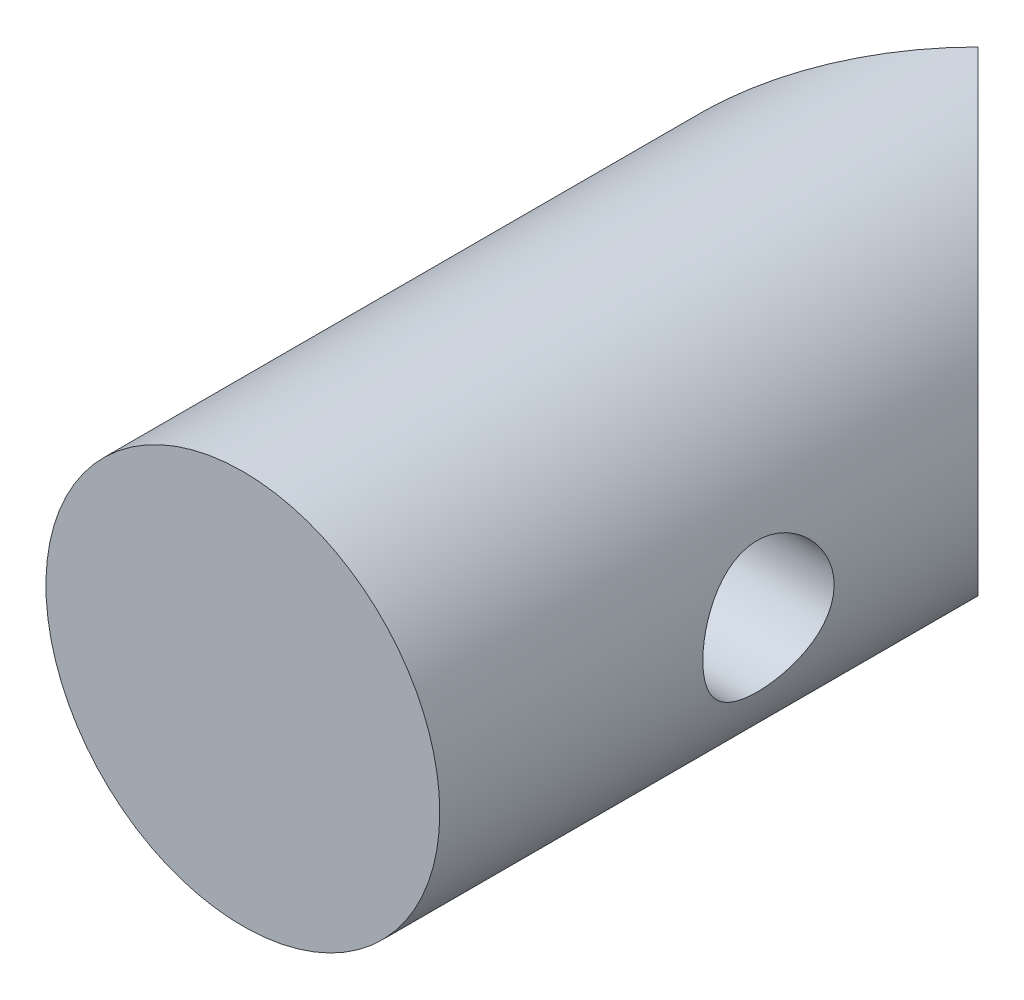
ISO-10303-21;
HEADER;
FILE_DESCRIPTION(('STEP AP214'),'2;1');
FILE_NAME('part.step','',(''),(''),'','','');
FILE_SCHEMA(('AUTOMOTIVE_DESIGN { 1 0 10303 214 1 1 1 1 }'));
ENDSEC;
DATA;
#1=APPLICATION_CONTEXT('core data for automotive mechanical design processes');
#2=APPLICATION_PROTOCOL_DEFINITION('international standard','automotive_design',2000,#1);
#3=PRODUCT_CONTEXT('',#1,'mechanical');
#4=PRODUCT('Part','Part','',(#3));
#5=PRODUCT_RELATED_PRODUCT_CATEGORY('part','',(#4));
#6=PRODUCT_DEFINITION_FORMATION('','',#4);
#7=PRODUCT_DEFINITION_CONTEXT('part definition',#1,'design');
#8=PRODUCT_DEFINITION('design','',#6,#7);
#9=PRODUCT_DEFINITION_SHAPE('','',#8);
#10=(LENGTH_UNIT() NAMED_UNIT(*) SI_UNIT(.MILLI.,.METRE.));
#11=(NAMED_UNIT(*) PLANE_ANGLE_UNIT() SI_UNIT($,.RADIAN.));
#12=(NAMED_UNIT(*) SI_UNIT($,.STERADIAN.) SOLID_ANGLE_UNIT());
#13=UNCERTAINTY_MEASURE_WITH_UNIT(LENGTH_MEASURE(1.E-05),#10,'distance_accuracy_value','');
#14=(GEOMETRIC_REPRESENTATION_CONTEXT(3) GLOBAL_UNCERTAINTY_ASSIGNED_CONTEXT((#13)) GLOBAL_UNIT_ASSIGNED_CONTEXT((#10,
#11,#12)) REPRESENTATION_CONTEXT('',''));
#15=CARTESIAN_POINT('',(0.,0.,0.));
#16=DIRECTION('',(0.,0.,1.));
#17=DIRECTION('',(1.,0.,0.));
#18=AXIS2_PLACEMENT_3D('',#15,#16,#17);
#19=CARTESIAN_POINT('',(0.,0.,17.78));
#20=DIRECTION('',(0.,0.,-1.));
#21=DIRECTION('',(-1.,0.,0.));
#22=AXIS2_PLACEMENT_3D('',#19,#20,#21);
#23=CYLINDRICAL_SURFACE('',#22,4.7625);
#24=CARTESIAN_POINT('',(4.7625,0.,11.4173));
#25=CARTESIAN_POINT('',(4.76250024290249,0.0866193385826713,11.417300402799));
#26=CARTESIAN_POINT('',(4.76011509093227,0.173236246329945,11.410187577523));
#27=CARTESIAN_POINT('',(4.75083521197708,0.34391879538584,11.3820112897527));
#28=CARTESIAN_POINT('',(4.74394001683417,0.427984170888619,11.3609463789811));
#29=CARTESIAN_POINT('',(4.72638926301478,0.591078303334064,11.3056682011278));
#30=CARTESIAN_POINT('',(4.7157399927273,0.670115223594073,11.2714769133459));
#31=CARTESIAN_POINT('',(4.6917680757628,0.821332712178446,11.1910158881191));
#32=CARTESIAN_POINT('',(4.67844490185098,0.893511924171937,11.1447437680584));
#33=CARTESIAN_POINT('',(4.65001124928271,1.03146490909784,11.0397515347867));
#34=CARTESIAN_POINT('',(4.63485795886259,1.09696837422356,10.9806879156115));
#35=CARTESIAN_POINT('',(4.60470749718205,1.21734689966455,10.8525196419033));
#36=CARTESIAN_POINT('',(4.58971036098747,1.27221961946451,10.783412782051));
#37=CARTESIAN_POINT('',(4.56109915307672,1.37132209578671,10.6346861296256));
#38=CARTESIAN_POINT('',(4.54753724850155,1.41520046242588,10.5548211881753));
#39=CARTESIAN_POINT('',(4.5239829735203,1.48878746228087,10.3883204500471));
#40=CARTESIAN_POINT('',(4.51398951405184,1.51850041960148,10.3016867290041));
#41=CARTESIAN_POINT('',(4.49915443940137,1.56189912014578,10.127181260874));
#42=CARTESIAN_POINT('',(4.49415052034258,1.57609134913142,10.0394496815236));
#43=CARTESIAN_POINT('',(4.48938104899343,1.58962903329347,9.86271879027754));
#44=CARTESIAN_POINT('',(4.48961387798584,1.58897907629748,9.77371987862416));
#45=CARTESIAN_POINT('',(4.49514936325486,1.57324409712917,9.60130059917012));
#46=CARTESIAN_POINT('',(4.50021985189709,1.55882008715259,9.51781116036606));
#47=CARTESIAN_POINT('',(4.51447944137725,1.51702478352344,9.35451294637415));
#48=CARTESIAN_POINT('',(4.52366903532271,1.48965193971458,9.27470461312183));
#49=CARTESIAN_POINT('',(4.54529683920858,1.42230325467057,9.11953226002353));
#50=CARTESIAN_POINT('',(4.55778498196574,1.38213155232277,9.04426050956713));
#51=CARTESIAN_POINT('',(4.58458186738966,1.29046145625622,8.90131743310594));
#52=CARTESIAN_POINT('',(4.59889113542361,1.23895979087785,8.83364831099326));
#53=CARTESIAN_POINT('',(4.62863135053789,1.12291706563304,8.70411708791978));
#54=CARTESIAN_POINT('',(4.64408185600813,1.05783562574614,8.64274259746686));
#55=CARTESIAN_POINT('',(4.67371014689421,0.91811406732747,8.53165161417187));
#56=CARTESIAN_POINT('',(4.68788781016682,0.843473033111537,8.48193623941387));
#57=CARTESIAN_POINT('',(4.71355908851247,0.685716835710945,8.39518212337684));
#58=CARTESIAN_POINT('',(4.72502468137762,0.60252495131093,8.3582740324966));
#59=CARTESIAN_POINT('',(4.7437765034179,0.430639669841152,8.29912746134532));
#60=CARTESIAN_POINT('',(4.75106418427121,0.341948195570986,8.2768838852653));
#61=CARTESIAN_POINT('',(4.76039857975912,0.165709329377768,8.24856163018952));
#62=CARTESIAN_POINT('',(4.76265877911043,0.0782789897854422,8.24182405293827));
#63=CARTESIAN_POINT('',(4.76232383028038,-0.0964804235618768,8.24282811933758));
#64=CARTESIAN_POINT('',(4.75972950165738,-0.183809511919945,8.25056731896806));
#65=CARTESIAN_POINT('',(4.75011789238403,-0.353250287758004,8.27978390353084));
#66=CARTESIAN_POINT('',(4.74323090454018,-0.435439830850312,8.30085685210358));
#67=CARTESIAN_POINT('',(4.72585806842736,-0.59508383424507,8.35563709309094));
#68=CARTESIAN_POINT('',(4.71537176124097,-0.672537689257409,8.38934599665512));
#69=CARTESIAN_POINT('',(4.69152178418573,-0.822782670524317,8.46942431054726));
#70=CARTESIAN_POINT('',(4.6780896842481,-0.895397560257215,8.51610341683704));
#71=CARTESIAN_POINT('',(4.64987090592067,-1.03197791784024,8.62043321314641));
#72=CARTESIAN_POINT('',(4.63508381455201,-1.09594073387547,8.67808725395044));
#73=CARTESIAN_POINT('',(4.60496996168956,-1.21642585614249,8.80582876722297));
#74=CARTESIAN_POINT('',(4.58964920726292,-1.27247803867765,8.8763621477464));
#75=CARTESIAN_POINT('',(4.5608870760535,-1.37200881668867,9.02616236389979));
#76=CARTESIAN_POINT('',(4.54744571493929,-1.41548730734047,9.1054292723316));
#77=CARTESIAN_POINT('',(4.52409546968822,-1.48843512703596,9.27048091177271));
#78=CARTESIAN_POINT('',(4.51417945258854,-1.51793278481196,9.35625205068042));
#79=CARTESIAN_POINT('',(4.49914696286489,-1.56193278348047,9.53195110694506));
#80=CARTESIAN_POINT('',(4.49402832815028,-1.57644187973937,9.62187713257941));
#81=CARTESIAN_POINT('',(4.48941600962757,-1.58952609843277,9.79836288996495));
#82=CARTESIAN_POINT('',(4.48964685408647,-1.58888153347707,9.88485821520533));
#83=CARTESIAN_POINT('',(4.4950264084539,-1.57359714084979,10.0564395564388));
#84=CARTESIAN_POINT('',(4.50017482566362,-1.55895814614049,10.1415256560037));
#85=CARTESIAN_POINT('',(4.51460432334016,-1.51665275334283,10.3062653650164));
#86=CARTESIAN_POINT('',(4.52380505610683,-1.48923906179962,10.3859914596946));
#87=CARTESIAN_POINT('',(4.54527283124319,-1.42236724314359,10.5397735085145));
#88=CARTESIAN_POINT('',(4.55754055411887,-1.38290644257916,10.613828199511));
#89=CARTESIAN_POINT('',(4.58442741396349,-1.29105134947619,10.7576678260026));
#90=CARTESIAN_POINT('',(4.59912579731893,-1.23816783538876,10.8271254467637));
#91=CARTESIAN_POINT('',(4.62888578099664,-1.12179557697784,10.9564325787474));
#92=CARTESIAN_POINT('',(4.64394748298391,-1.05830383406672,11.0162793639048));
#93=CARTESIAN_POINT('',(4.67344173459301,-0.919545971611587,11.1270167545091));
#94=CARTESIAN_POINT('',(4.68782688609495,-0.843917402680814,11.1774674020547));
#95=CARTESIAN_POINT('',(4.71370010986522,-0.684779804883013,11.2648848058004));
#96=CARTESIAN_POINT('',(4.72518892253839,-0.6012727975351,11.3018550091512));
#97=CARTESIAN_POINT('',(4.7435375517131,-0.432583664931547,11.3597080915758));
#98=CARTESIAN_POINT('',(4.75058124720755,-0.347643065311297,11.3812359151931));
#99=CARTESIAN_POINT('',(4.76006171214452,-0.175133660416267,11.4100296955749));
#100=CARTESIAN_POINT('',(4.76249975444399,-0.0875655880903854,11.4172995928007));
#101=CARTESIAN_POINT('',(4.7625,0.,11.4173));
#102=B_SPLINE_CURVE_WITH_KNOTS('',3,(#24,#25,#26,#27,#28,#29,#30,#31,#32,#33,#34,#35,#36,#37,
#38,#39,#40,#41,#42,#43,#44,#45,#46,#47,#48,#49,#50,#51,#52,#53,#54,#55,#56,#57,#58,#59,#60,#61,
#62,#63,#64,#65,#66,#67,#68,#69,#70,#71,#72,#73,#74,#75,#76,#77,#78,#79,#80,#81,#82,#83,#84,#85,
#86,#87,#88,#89,#90,#91,#92,#93,#94,#95,#96,#97,#98,#99,#100,#101),.UNSPECIFIED.,.T.,.F.,(4,2,2,
2,2,2,2,2,2,2,2,2,2,2,2,2,2,2,2,2,2,2,2,2,2,2,2,2,2,2,2,2,2,2,2,2,2,2,4),(0.,0.25953578081629,
0.519098506612185,0.778228493181554,1.03740962475606,1.30468186298874,1.57201287843953,
1.84703060907258,2.12196433449871,2.3876305711517,2.65321468955131,2.90666212150155,
3.16013990233075,3.41769971708767,3.67533400311151,3.94641872975542,4.21752944222003,
4.49132968969939,4.76503474342565,5.02687563290578,5.28867232148126,5.5428857579041,
5.79713161888511,6.05806509751927,6.31907837054748,6.59195123823189,6.86482638073052,
7.13714621949993,7.40934326970516,7.66755619877005,7.92575375970303,8.17904744490157,
8.43239738104358,8.69680230873234,8.96128210158992,9.23606961575715,9.51078681329518,
9.77323036418422,10.0356013733554),.UNSPECIFIED.);
#103=CARTESIAN_POINT('',(4.7625,0.,11.4173));
#104=VERTEX_POINT('',#103);
#105=EDGE_CURVE('E36',#104,#104,#102,.T.);
#106=ORIENTED_EDGE('',*,*,#105,.T.);
#107=EDGE_LOOP('',(#106));
#108=FACE_BOUND('',#107,.T.);
#109=CARTESIAN_POINT('',(0.,0.,17.78));
#110=DIRECTION('',(0.,0.,1.));
#111=DIRECTION('',(1.,0.,0.));
#112=AXIS2_PLACEMENT_3D('',#109,#110,#111);
#113=CIRCLE('',#112,4.7625);
#114=CARTESIAN_POINT('',(4.7625,0.,17.78));
#115=VERTEX_POINT('',#114);
#116=EDGE_CURVE('E11',#115,#115,#113,.T.);
#117=ORIENTED_EDGE('',*,*,#116,.F.);
#118=EDGE_LOOP('',(#117));
#119=FACE_BOUND('',#118,.T.);
#120=CARTESIAN_POINT('',(0.,0.,0.));
#121=DIRECTION('',(-0.707106781186549,0.,0.707106781186546));
#122=DIRECTION('',(-0.707106781186546,0.,-0.707106781186549));
#123=AXIS2_PLACEMENT_3D('',#120,#121,#122);
#124=ELLIPSE('',#123,6.73519209080188,4.7625);
#125=CARTESIAN_POINT('',(0.,-4.7625,0.));
#126=VERTEX_POINT('',#125);
#127=CARTESIAN_POINT('',(0.,4.7625,0.));
#128=VERTEX_POINT('',#127);
#129=EDGE_CURVE('E50',#126,#128,#124,.T.);
#130=ORIENTED_EDGE('',*,*,#129,.T.);
#131=CARTESIAN_POINT('',(0.,0.,0.));
#132=DIRECTION('',(0.707106781186549,0.,0.707106781186546));
#133=DIRECTION('',(0.707106781186546,0.,-0.707106781186549));
#134=AXIS2_PLACEMENT_3D('',#131,#132,#133);
#135=ELLIPSE('',#134,6.73519209080188,4.7625);
#136=EDGE_CURVE('E44',#128,#126,#135,.T.);
#137=ORIENTED_EDGE('',*,*,#136,.T.);
#138=EDGE_LOOP('',(#130,#137));
#139=FACE_BOUND('',#138,.T.);
#140=ADVANCED_FACE('F32',(#108,#119,#139),#23,.T.);
#141=CARTESIAN_POINT('',(0.,0.,17.78));
#142=DIRECTION('',(0.,0.,1.));
#143=DIRECTION('',(1.,0.,0.));
#144=AXIS2_PLACEMENT_3D('',#141,#142,#143);
#145=PLANE('',#144);
#146=ORIENTED_EDGE('',*,*,#116,.T.);
#147=EDGE_LOOP('',(#146));
#148=FACE_BOUND('',#147,.T.);
#149=ADVANCED_FACE('F79',(#148),#145,.T.);
#150=CARTESIAN_POINT('',(-4.7625,-4.7625,4.76250000000002));
#151=DIRECTION('',(0.707106781186549,0.,0.707106781186546));
#152=DIRECTION('',(0.707106781186546,0.,-0.707106781186549));
#153=AXIS2_PLACEMENT_3D('',#150,#151,#152);
#154=PLANE('',#153);
#155=DIRECTION('',(0.,1.,0.));
#156=VECTOR('',#155,1.);
#157=CARTESIAN_POINT('',(0.,-4.7625,0.));
#158=LINE('',#157,#156);
#159=EDGE_CURVE('E58',#126,#128,#158,.T.);
#160=ORIENTED_EDGE('',*,*,#159,.F.);
#161=ORIENTED_EDGE('',*,*,#136,.F.);
#162=EDGE_LOOP('',(#160,#161));
#163=FACE_BOUND('',#162,.T.);
#164=ADVANCED_FACE('F60',(#163),#154,.F.);
#165=CARTESIAN_POINT('',(0.,-4.7625,0.));
#166=DIRECTION('',(-0.707106781186549,0.,0.707106781186546));
#167=DIRECTION('',(0.707106781186546,0.,0.707106781186549));
#168=AXIS2_PLACEMENT_3D('',#165,#166,#167);
#169=PLANE('',#168);
#170=ORIENTED_EDGE('',*,*,#159,.T.);
#171=ORIENTED_EDGE('',*,*,#129,.F.);
#172=EDGE_LOOP('',(#170,#171));
#173=FACE_BOUND('',#172,.T.);
#174=ADVANCED_FACE('F57',(#173),#169,.F.);
#175=CARTESIAN_POINT('',(0.,0.,9.8298));
#176=DIRECTION('',(-1.,0.,0.));
#177=DIRECTION('',(0.,0.,1.));
#178=AXIS2_PLACEMENT_3D('',#175,#176,#177);
#179=CYLINDRICAL_SURFACE('',#178,1.58749999999999);
#180=CARTESIAN_POINT('',(0.,0.,9.8298));
#181=DIRECTION('',(-1.,0.,0.));
#182=DIRECTION('',(0.,0.,1.));
#183=AXIS2_PLACEMENT_3D('',#180,#181,#182);
#184=CIRCLE('',#183,1.58749999999999);
#185=CARTESIAN_POINT('',(0.,0.,11.4173));
#186=VERTEX_POINT('',#185);
#187=EDGE_CURVE('E63',#186,#186,#184,.T.);
#188=ORIENTED_EDGE('',*,*,#187,.T.);
#189=EDGE_LOOP('',(#188));
#190=FACE_BOUND('',#189,.T.);
#191=ORIENTED_EDGE('',*,*,#105,.F.);
#192=EDGE_LOOP('',(#191));
#193=FACE_BOUND('',#192,.T.);
#194=ADVANCED_FACE('F68',(#190,#193),#179,.F.);
#195=CARTESIAN_POINT('',(0.,1.58749999999999,9.8298));
#196=DIRECTION('',(-1.,0.,0.));
#197=DIRECTION('',(0.,0.,1.));
#198=AXIS2_PLACEMENT_3D('',#195,#196,#197);
#199=PLANE('',#198);
#200=ORIENTED_EDGE('',*,*,#187,.F.);
#201=EDGE_LOOP('',(#200));
#202=FACE_BOUND('',#201,.T.);
#203=ADVANCED_FACE('F71',(#202),#199,.F.);
#204=CLOSED_SHELL('',(#140,#149,#164,#174,#194,#203));
#205=MANIFOLD_SOLID_BREP('B2',#204);
#206=ADVANCED_BREP_SHAPE_REPRESENTATION('',(#18,#205),#14);
#207=SHAPE_DEFINITION_REPRESENTATION(#9,#206);
ENDSEC;
END-ISO-10303-21;
